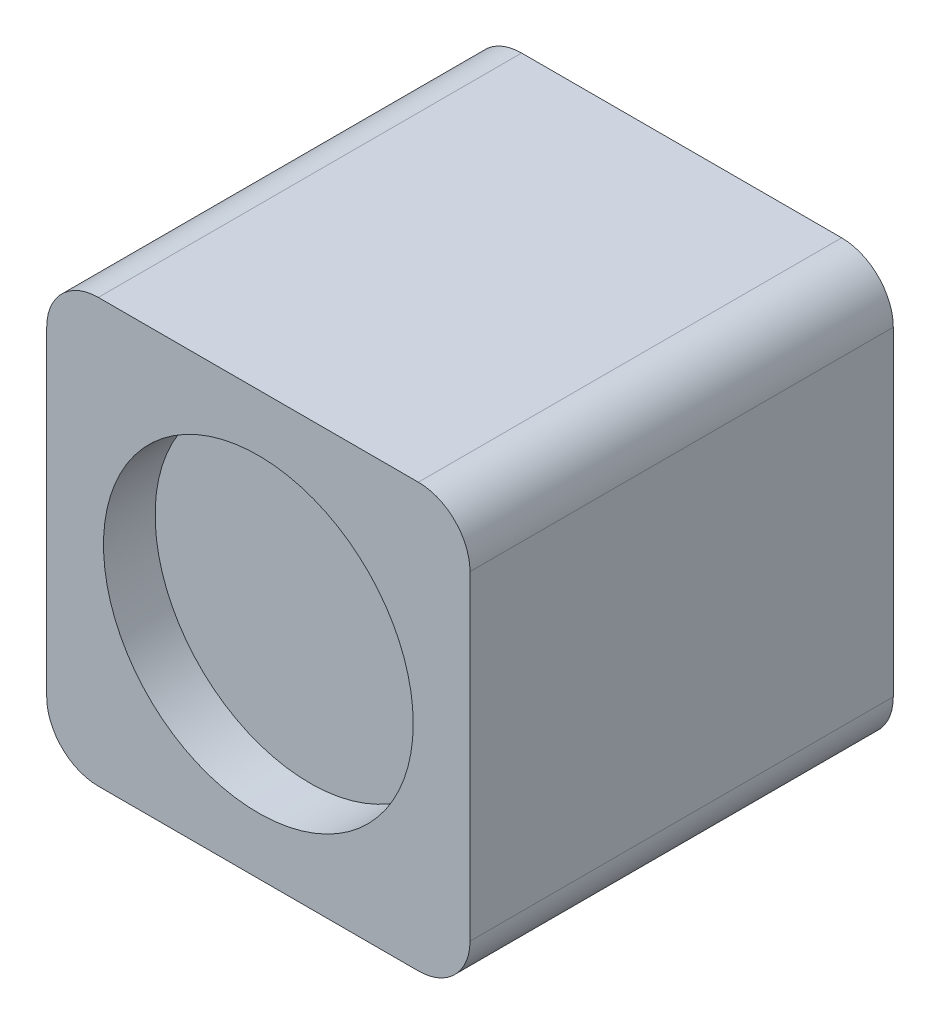
ISO-10303-21;
HEADER;
FILE_DESCRIPTION(('STEP AP214'),'2;1');
FILE_NAME('part.step','',(''),(''),'','','');
FILE_SCHEMA(('AUTOMOTIVE_DESIGN { 1 0 10303 214 1 1 1 1 }'));
ENDSEC;
DATA;
#1=APPLICATION_CONTEXT('core data for automotive mechanical design processes');
#2=APPLICATION_PROTOCOL_DEFINITION('international standard','automotive_design',2000,#1);
#3=PRODUCT_CONTEXT('',#1,'mechanical');
#4=PRODUCT('Part','Part','',(#3));
#5=PRODUCT_RELATED_PRODUCT_CATEGORY('part','',(#4));
#6=PRODUCT_DEFINITION_FORMATION('','',#4);
#7=PRODUCT_DEFINITION_CONTEXT('part definition',#1,'design');
#8=PRODUCT_DEFINITION('design','',#6,#7);
#9=PRODUCT_DEFINITION_SHAPE('','',#8);
#10=(LENGTH_UNIT() NAMED_UNIT(*) SI_UNIT(.MILLI.,.METRE.));
#11=(NAMED_UNIT(*) PLANE_ANGLE_UNIT() SI_UNIT($,.RADIAN.));
#12=(NAMED_UNIT(*) SI_UNIT($,.STERADIAN.) SOLID_ANGLE_UNIT());
#13=UNCERTAINTY_MEASURE_WITH_UNIT(LENGTH_MEASURE(1.E-05),#10,'distance_accuracy_value','');
#14=(GEOMETRIC_REPRESENTATION_CONTEXT(3) GLOBAL_UNCERTAINTY_ASSIGNED_CONTEXT((#13)) GLOBAL_UNIT_ASSIGNED_CONTEXT((#10,
#11,#12)) REPRESENTATION_CONTEXT('',''));
#15=CARTESIAN_POINT('',(0.,0.,0.));
#16=DIRECTION('',(0.,0.,1.));
#17=DIRECTION('',(1.,0.,0.));
#18=AXIS2_PLACEMENT_3D('',#15,#16,#17);
#19=CARTESIAN_POINT('',(20.5,20.5,41.));
#20=DIRECTION('',(-1.,0.,0.));
#21=DIRECTION('',(0.,-1.,0.));
#22=AXIS2_PLACEMENT_3D('',#19,#20,#21);
#23=PLANE('',#22);
#24=DIRECTION('',(0.,1.,0.));
#25=VECTOR('',#24,1.);
#26=CARTESIAN_POINT('',(20.5,20.5,41.));
#27=LINE('',#26,#25);
#28=CARTESIAN_POINT('',(20.5,-15.5,41.));
#29=VERTEX_POINT('',#28);
#30=CARTESIAN_POINT('',(20.5,15.5,41.));
#31=VERTEX_POINT('',#30);
#32=EDGE_CURVE('E135',#29,#31,#27,.T.);
#33=ORIENTED_EDGE('',*,*,#32,.F.);
#34=DIRECTION('',(0.,0.,-1.));
#35=VECTOR('',#34,1.);
#36=CARTESIAN_POINT('',(20.5,-15.5,41.));
#37=LINE('',#36,#35);
#38=CARTESIAN_POINT('',(20.5,-15.5,0.));
#39=VERTEX_POINT('',#38);
#40=EDGE_CURVE('E174',#29,#39,#37,.T.);
#41=ORIENTED_EDGE('',*,*,#40,.T.);
#42=DIRECTION('',(0.,1.,0.));
#43=VECTOR('',#42,1.);
#44=CARTESIAN_POINT('',(20.5,20.5,0.));
#45=LINE('',#44,#43);
#46=CARTESIAN_POINT('',(20.5,15.5,0.));
#47=VERTEX_POINT('',#46);
#48=EDGE_CURVE('E189',#39,#47,#45,.T.);
#49=ORIENTED_EDGE('',*,*,#48,.T.);
#50=DIRECTION('',(0.,0.,-1.));
#51=VECTOR('',#50,1.);
#52=CARTESIAN_POINT('',(20.5,15.5,41.));
#53=LINE('',#52,#51);
#54=EDGE_CURVE('E171',#47,#31,#53,.F.);
#55=ORIENTED_EDGE('',*,*,#54,.T.);
#56=EDGE_LOOP('',(#33,#41,#49,#55));
#57=FACE_BOUND('',#56,.T.);
#58=ADVANCED_FACE('F39',(#57),#23,.F.);
#59=CARTESIAN_POINT('',(-20.5,20.5,41.));
#60=DIRECTION('',(0.,-1.,0.));
#61=DIRECTION('',(0.,0.,-1.));
#62=AXIS2_PLACEMENT_3D('',#59,#60,#61);
#63=PLANE('',#62);
#64=DIRECTION('',(-1.,0.,0.));
#65=VECTOR('',#64,1.);
#66=CARTESIAN_POINT('',(-20.5,20.5,41.));
#67=LINE('',#66,#65);
#68=CARTESIAN_POINT('',(15.5,20.5,41.));
#69=VERTEX_POINT('',#68);
#70=CARTESIAN_POINT('',(-15.5,20.5,41.));
#71=VERTEX_POINT('',#70);
#72=EDGE_CURVE('E140',#69,#71,#67,.T.);
#73=ORIENTED_EDGE('',*,*,#72,.F.);
#74=DIRECTION('',(0.,0.,-1.));
#75=VECTOR('',#74,1.);
#76=CARTESIAN_POINT('',(15.5,20.5,41.));
#77=LINE('',#76,#75);
#78=CARTESIAN_POINT('',(15.5,20.5,0.));
#79=VERTEX_POINT('',#78);
#80=EDGE_CURVE('E11',#69,#79,#77,.T.);
#81=ORIENTED_EDGE('',*,*,#80,.T.);
#82=DIRECTION('',(-1.,0.,0.));
#83=VECTOR('',#82,1.);
#84=CARTESIAN_POINT('',(-20.5,20.5,0.));
#85=LINE('',#84,#83);
#86=CARTESIAN_POINT('',(-15.5,20.5,0.));
#87=VERTEX_POINT('',#86);
#88=EDGE_CURVE('E142',#79,#87,#85,.T.);
#89=ORIENTED_EDGE('',*,*,#88,.T.);
#90=DIRECTION('',(0.,0.,-1.));
#91=VECTOR('',#90,1.);
#92=CARTESIAN_POINT('',(-15.5,20.5,41.));
#93=LINE('',#92,#91);
#94=EDGE_CURVE('E48',#87,#71,#93,.F.);
#95=ORIENTED_EDGE('',*,*,#94,.T.);
#96=EDGE_LOOP('',(#73,#81,#89,#95));
#97=FACE_BOUND('',#96,.T.);
#98=ADVANCED_FACE('F195',(#97),#63,.F.);
#99=CARTESIAN_POINT('',(-20.5,20.5,41.));
#100=DIRECTION('',(1.,0.,0.));
#101=DIRECTION('',(0.,1.,0.));
#102=AXIS2_PLACEMENT_3D('',#99,#100,#101);
#103=PLANE('',#102);
#104=DIRECTION('',(0.,-1.,0.));
#105=VECTOR('',#104,1.);
#106=CARTESIAN_POINT('',(-20.5,20.5,0.));
#107=LINE('',#106,#105);
#108=CARTESIAN_POINT('',(-20.5,15.5,0.));
#109=VERTEX_POINT('',#108);
#110=CARTESIAN_POINT('',(-20.5,-15.5,0.));
#111=VERTEX_POINT('',#110);
#112=EDGE_CURVE('E136',#109,#111,#107,.T.);
#113=ORIENTED_EDGE('',*,*,#112,.T.);
#114=DIRECTION('',(0.,0.,-1.));
#115=VECTOR('',#114,1.);
#116=CARTESIAN_POINT('',(-20.5,-15.5,41.));
#117=LINE('',#116,#115);
#118=CARTESIAN_POINT('',(-20.5,-15.5,41.));
#119=VERTEX_POINT('',#118);
#120=EDGE_CURVE('E111',#111,#119,#117,.F.);
#121=ORIENTED_EDGE('',*,*,#120,.T.);
#122=DIRECTION('',(0.,-1.,0.));
#123=VECTOR('',#122,1.);
#124=CARTESIAN_POINT('',(-20.5,20.5,41.));
#125=LINE('',#124,#123);
#126=CARTESIAN_POINT('',(-20.5,15.5,41.));
#127=VERTEX_POINT('',#126);
#128=EDGE_CURVE('E180',#127,#119,#125,.T.);
#129=ORIENTED_EDGE('',*,*,#128,.F.);
#130=DIRECTION('',(0.,0.,-1.));
#131=VECTOR('',#130,1.);
#132=CARTESIAN_POINT('',(-20.5,15.5,41.));
#133=LINE('',#132,#131);
#134=EDGE_CURVE('E117',#127,#109,#133,.T.);
#135=ORIENTED_EDGE('',*,*,#134,.T.);
#136=EDGE_LOOP('',(#113,#121,#129,#135));
#137=FACE_BOUND('',#136,.T.);
#138=ADVANCED_FACE('F202',(#137),#103,.F.);
#139=CARTESIAN_POINT('',(-20.5,-20.5,41.));
#140=DIRECTION('',(0.,1.,0.));
#141=DIRECTION('',(0.,0.,1.));
#142=AXIS2_PLACEMENT_3D('',#139,#140,#141);
#143=PLANE('',#142);
#144=DIRECTION('',(1.,0.,0.));
#145=VECTOR('',#144,1.);
#146=CARTESIAN_POINT('',(-20.5,-20.5,41.));
#147=LINE('',#146,#145);
#148=CARTESIAN_POINT('',(-15.5,-20.5,41.));
#149=VERTEX_POINT('',#148);
#150=CARTESIAN_POINT('',(15.5,-20.5,41.));
#151=VERTEX_POINT('',#150);
#152=EDGE_CURVE('E127',#149,#151,#147,.T.);
#153=ORIENTED_EDGE('',*,*,#152,.F.);
#154=DIRECTION('',(0.,0.,-1.));
#155=VECTOR('',#154,1.);
#156=CARTESIAN_POINT('',(-15.5,-20.5,41.));
#157=LINE('',#156,#155);
#158=CARTESIAN_POINT('',(-15.5,-20.5,0.));
#159=VERTEX_POINT('',#158);
#160=EDGE_CURVE('E110',#149,#159,#157,.T.);
#161=ORIENTED_EDGE('',*,*,#160,.T.);
#162=DIRECTION('',(1.,0.,0.));
#163=VECTOR('',#162,1.);
#164=CARTESIAN_POINT('',(-20.5,-20.5,0.));
#165=LINE('',#164,#163);
#166=CARTESIAN_POINT('',(15.5,-20.5,0.));
#167=VERTEX_POINT('',#166);
#168=EDGE_CURVE('E124',#159,#167,#165,.T.);
#169=ORIENTED_EDGE('',*,*,#168,.T.);
#170=DIRECTION('',(0.,0.,-1.));
#171=VECTOR('',#170,1.);
#172=CARTESIAN_POINT('',(15.5,-20.5,41.));
#173=LINE('',#172,#171);
#174=EDGE_CURVE('E130',#167,#151,#173,.F.);
#175=ORIENTED_EDGE('',*,*,#174,.T.);
#176=EDGE_LOOP('',(#153,#161,#169,#175));
#177=FACE_BOUND('',#176,.T.);
#178=ADVANCED_FACE('F123',(#177),#143,.F.);
#179=CARTESIAN_POINT('',(0.,0.,41.));
#180=DIRECTION('',(0.,0.,1.));
#181=DIRECTION('',(1.,0.,0.));
#182=AXIS2_PLACEMENT_3D('',#179,#180,#181);
#183=PLANE('',#182);
#184=CARTESIAN_POINT('',(0.,0.,41.));
#185=DIRECTION('',(0.,0.,1.));
#186=DIRECTION('',(1.,0.,0.));
#187=AXIS2_PLACEMENT_3D('',#184,#185,#186);
#188=CIRCLE('',#187,15.);
#189=CARTESIAN_POINT('',(15.,0.,41.));
#190=VERTEX_POINT('',#189);
#191=EDGE_CURVE('E316',#190,#190,#188,.T.);
#192=ORIENTED_EDGE('',*,*,#191,.F.);
#193=EDGE_LOOP('',(#192));
#194=FACE_BOUND('',#193,.T.);
#195=ORIENTED_EDGE('',*,*,#128,.T.);
#196=CARTESIAN_POINT('',(-15.5,-15.5,41.));
#197=DIRECTION('',(0.,0.,1.));
#198=DIRECTION('',(1.,0.,0.));
#199=AXIS2_PLACEMENT_3D('',#196,#197,#198);
#200=CIRCLE('',#199,5.);
#201=EDGE_CURVE('E168',#119,#149,#200,.T.);
#202=ORIENTED_EDGE('',*,*,#201,.T.);
#203=ORIENTED_EDGE('',*,*,#152,.T.);
#204=CARTESIAN_POINT('',(15.5,-15.5,41.));
#205=DIRECTION('',(0.,0.,1.));
#206=DIRECTION('',(1.,0.,0.));
#207=AXIS2_PLACEMENT_3D('',#204,#205,#206);
#208=CIRCLE('',#207,5.);
#209=EDGE_CURVE('E165',#151,#29,#208,.T.);
#210=ORIENTED_EDGE('',*,*,#209,.T.);
#211=ORIENTED_EDGE('',*,*,#32,.T.);
#212=CARTESIAN_POINT('',(15.5,15.5,41.));
#213=DIRECTION('',(0.,0.,1.));
#214=DIRECTION('',(1.,0.,0.));
#215=AXIS2_PLACEMENT_3D('',#212,#213,#214);
#216=CIRCLE('',#215,5.);
#217=EDGE_CURVE('E61',#31,#69,#216,.T.);
#218=ORIENTED_EDGE('',*,*,#217,.T.);
#219=ORIENTED_EDGE('',*,*,#72,.T.);
#220=CARTESIAN_POINT('',(-15.5,15.5,41.));
#221=DIRECTION('',(0.,0.,1.));
#222=DIRECTION('',(1.,0.,0.));
#223=AXIS2_PLACEMENT_3D('',#220,#221,#222);
#224=CIRCLE('',#223,5.);
#225=EDGE_CURVE('E160',#71,#127,#224,.T.);
#226=ORIENTED_EDGE('',*,*,#225,.T.);
#227=EDGE_LOOP('',(#195,#202,#203,#210,#211,#218,#219,#226));
#228=FACE_BOUND('',#227,.T.);
#229=ADVANCED_FACE('F200',(#194,#228),#183,.T.);
#230=CARTESIAN_POINT('',(0.,0.,0.));
#231=DIRECTION('',(0.,0.,1.));
#232=DIRECTION('',(1.,0.,0.));
#233=AXIS2_PLACEMENT_3D('',#230,#231,#232);
#234=PLANE('',#233);
#235=ORIENTED_EDGE('',*,*,#168,.F.);
#236=CARTESIAN_POINT('',(-15.5,-15.5,0.));
#237=DIRECTION('',(0.,0.,1.));
#238=DIRECTION('',(1.,0.,0.));
#239=AXIS2_PLACEMENT_3D('',#236,#237,#238);
#240=CIRCLE('',#239,5.);
#241=EDGE_CURVE('E106',#159,#111,#240,.F.);
#242=ORIENTED_EDGE('',*,*,#241,.T.);
#243=ORIENTED_EDGE('',*,*,#112,.F.);
#244=CARTESIAN_POINT('',(-15.5,15.5,0.));
#245=DIRECTION('',(0.,0.,1.));
#246=DIRECTION('',(1.,0.,0.));
#247=AXIS2_PLACEMENT_3D('',#244,#245,#246);
#248=CIRCLE('',#247,5.);
#249=EDGE_CURVE('E129',#109,#87,#248,.F.);
#250=ORIENTED_EDGE('',*,*,#249,.T.);
#251=ORIENTED_EDGE('',*,*,#88,.F.);
#252=CARTESIAN_POINT('',(15.5,15.5,0.));
#253=DIRECTION('',(0.,0.,1.));
#254=DIRECTION('',(1.,0.,0.));
#255=AXIS2_PLACEMENT_3D('',#252,#253,#254);
#256=CIRCLE('',#255,5.);
#257=EDGE_CURVE('E150',#79,#47,#256,.F.);
#258=ORIENTED_EDGE('',*,*,#257,.T.);
#259=ORIENTED_EDGE('',*,*,#48,.F.);
#260=CARTESIAN_POINT('',(15.5,-15.5,0.));
#261=DIRECTION('',(0.,0.,1.));
#262=DIRECTION('',(1.,0.,0.));
#263=AXIS2_PLACEMENT_3D('',#260,#261,#262);
#264=CIRCLE('',#263,5.);
#265=EDGE_CURVE('E118',#39,#167,#264,.F.);
#266=ORIENTED_EDGE('',*,*,#265,.T.);
#267=EDGE_LOOP('',(#235,#242,#243,#250,#251,#258,#259,#266));
#268=FACE_BOUND('',#267,.T.);
#269=ADVANCED_FACE('F132',(#268),#234,.F.);
#270=CARTESIAN_POINT('',(0.,0.,36.));
#271=DIRECTION('',(0.,0.,1.));
#272=DIRECTION('',(1.,0.,0.));
#273=AXIS2_PLACEMENT_3D('',#270,#271,#272);
#274=CYLINDRICAL_SURFACE('',#273,15.);
#275=CARTESIAN_POINT('',(0.,0.,36.));
#276=DIRECTION('',(0.,0.,1.));
#277=DIRECTION('',(1.,0.,0.));
#278=AXIS2_PLACEMENT_3D('',#275,#276,#277);
#279=CIRCLE('',#278,15.);
#280=CARTESIAN_POINT('',(15.,0.,36.));
#281=VERTEX_POINT('',#280);
#282=EDGE_CURVE('E192',#281,#281,#279,.T.);
#283=ORIENTED_EDGE('',*,*,#282,.F.);
#284=EDGE_LOOP('',(#283));
#285=FACE_BOUND('',#284,.T.);
#286=ORIENTED_EDGE('',*,*,#191,.T.);
#287=EDGE_LOOP('',(#286));
#288=FACE_BOUND('',#287,.T.);
#289=ADVANCED_FACE('F262',(#285,#288),#274,.F.);
#290=CARTESIAN_POINT('',(0.,0.,36.));
#291=DIRECTION('',(0.,0.,1.));
#292=DIRECTION('',(1.,0.,0.));
#293=AXIS2_PLACEMENT_3D('',#290,#291,#292);
#294=PLANE('',#293);
#295=ORIENTED_EDGE('',*,*,#282,.T.);
#296=EDGE_LOOP('',(#295));
#297=FACE_BOUND('',#296,.T.);
#298=ADVANCED_FACE('F221',(#297),#294,.T.);
#299=CARTESIAN_POINT('',(-15.5,-15.5,41.));
#300=DIRECTION('',(0.,0.,-1.));
#301=DIRECTION('',(-1.,0.,0.));
#302=AXIS2_PLACEMENT_3D('',#299,#300,#301);
#303=CYLINDRICAL_SURFACE('',#302,5.);
#304=ORIENTED_EDGE('',*,*,#201,.F.);
#305=ORIENTED_EDGE('',*,*,#120,.F.);
#306=ORIENTED_EDGE('',*,*,#241,.F.);
#307=ORIENTED_EDGE('',*,*,#160,.F.);
#308=EDGE_LOOP('',(#304,#305,#306,#307));
#309=FACE_BOUND('',#308,.T.);
#310=ADVANCED_FACE('F109',(#309),#303,.T.);
#311=CARTESIAN_POINT('',(15.5,-15.5,41.));
#312=DIRECTION('',(0.,0.,-1.));
#313=DIRECTION('',(-1.,0.,0.));
#314=AXIS2_PLACEMENT_3D('',#311,#312,#313);
#315=CYLINDRICAL_SURFACE('',#314,5.);
#316=ORIENTED_EDGE('',*,*,#209,.F.);
#317=ORIENTED_EDGE('',*,*,#174,.F.);
#318=ORIENTED_EDGE('',*,*,#265,.F.);
#319=ORIENTED_EDGE('',*,*,#40,.F.);
#320=EDGE_LOOP('',(#316,#317,#318,#319));
#321=FACE_BOUND('',#320,.T.);
#322=ADVANCED_FACE('F220',(#321),#315,.T.);
#323=CARTESIAN_POINT('',(15.5,15.5,41.));
#324=DIRECTION('',(0.,0.,-1.));
#325=DIRECTION('',(-1.,0.,0.));
#326=AXIS2_PLACEMENT_3D('',#323,#324,#325);
#327=CYLINDRICAL_SURFACE('',#326,5.);
#328=ORIENTED_EDGE('',*,*,#217,.F.);
#329=ORIENTED_EDGE('',*,*,#54,.F.);
#330=ORIENTED_EDGE('',*,*,#257,.F.);
#331=ORIENTED_EDGE('',*,*,#80,.F.);
#332=EDGE_LOOP('',(#328,#329,#330,#331));
#333=FACE_BOUND('',#332,.T.);
#334=ADVANCED_FACE('F223',(#333),#327,.T.);
#335=CARTESIAN_POINT('',(-15.5,15.5,41.));
#336=DIRECTION('',(0.,0.,-1.));
#337=DIRECTION('',(-1.,0.,0.));
#338=AXIS2_PLACEMENT_3D('',#335,#336,#337);
#339=CYLINDRICAL_SURFACE('',#338,5.);
#340=ORIENTED_EDGE('',*,*,#225,.F.);
#341=ORIENTED_EDGE('',*,*,#94,.F.);
#342=ORIENTED_EDGE('',*,*,#249,.F.);
#343=ORIENTED_EDGE('',*,*,#134,.F.);
#344=EDGE_LOOP('',(#340,#341,#342,#343));
#345=FACE_BOUND('',#344,.T.);
#346=ADVANCED_FACE('F41',(#345),#339,.T.);
#347=CLOSED_SHELL('',(#58,#98,#138,#178,#229,#269,#289,#298,#310,#322,#334,#346));
#348=MANIFOLD_SOLID_BREP('B2',#347);
#349=ADVANCED_BREP_SHAPE_REPRESENTATION('',(#18,#348),#14);
#350=SHAPE_DEFINITION_REPRESENTATION(#9,#349);
ENDSEC;
END-ISO-10303-21;
